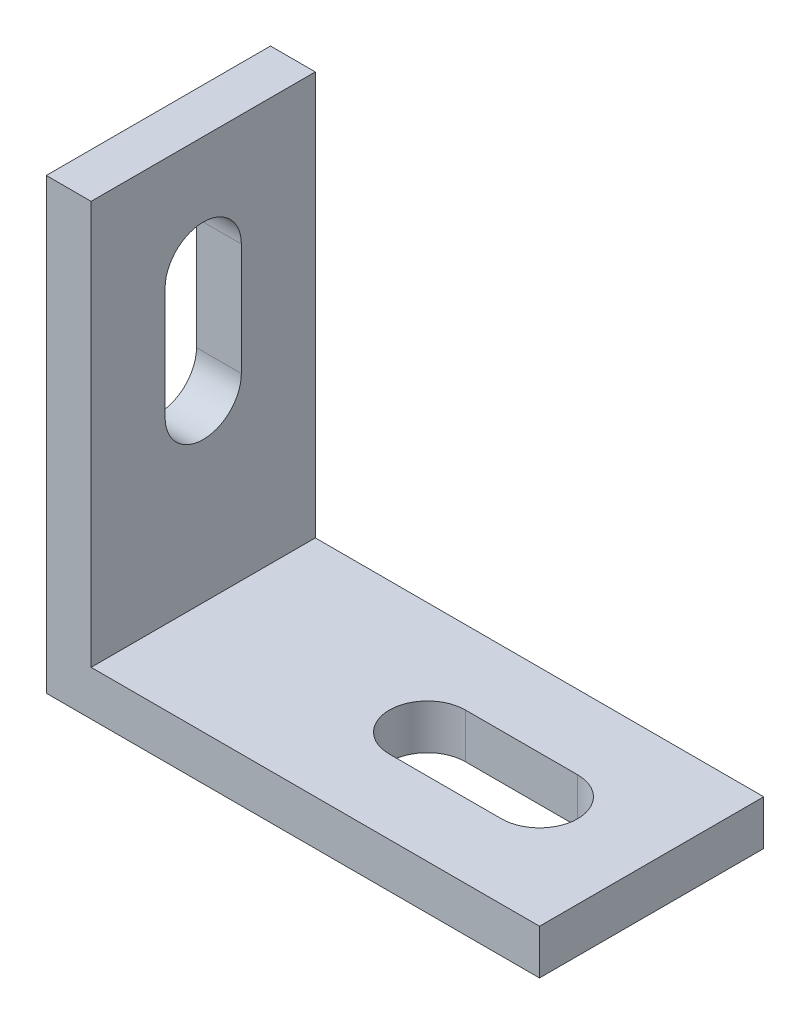
ISO-10303-21;
HEADER;
FILE_DESCRIPTION(('STEP AP214'),'2;1');
FILE_NAME('part.step','',(''),(''),'','','');
FILE_SCHEMA(('AUTOMOTIVE_DESIGN { 1 0 10303 214 1 1 1 1 }'));
ENDSEC;
DATA;
#1=APPLICATION_CONTEXT('core data for automotive mechanical design processes');
#2=APPLICATION_PROTOCOL_DEFINITION('international standard','automotive_design',2000,#1);
#3=PRODUCT_CONTEXT('',#1,'mechanical');
#4=PRODUCT('Part','Part','',(#3));
#5=PRODUCT_RELATED_PRODUCT_CATEGORY('part','',(#4));
#6=PRODUCT_DEFINITION_FORMATION('','',#4);
#7=PRODUCT_DEFINITION_CONTEXT('part definition',#1,'design');
#8=PRODUCT_DEFINITION('design','',#6,#7);
#9=PRODUCT_DEFINITION_SHAPE('','',#8);
#10=(LENGTH_UNIT() NAMED_UNIT(*) SI_UNIT(.MILLI.,.METRE.));
#11=(NAMED_UNIT(*) PLANE_ANGLE_UNIT() SI_UNIT($,.RADIAN.));
#12=(NAMED_UNIT(*) SI_UNIT($,.STERADIAN.) SOLID_ANGLE_UNIT());
#13=UNCERTAINTY_MEASURE_WITH_UNIT(LENGTH_MEASURE(1.E-05),#10,'distance_accuracy_value','');
#14=(GEOMETRIC_REPRESENTATION_CONTEXT(3) GLOBAL_UNCERTAINTY_ASSIGNED_CONTEXT((#13)) GLOBAL_UNIT_ASSIGNED_CONTEXT((#10,
#11,#12)) REPRESENTATION_CONTEXT('',''));
#15=CARTESIAN_POINT('',(0.,0.,0.));
#16=DIRECTION('',(0.,0.,1.));
#17=DIRECTION('',(1.,0.,0.));
#18=AXIS2_PLACEMENT_3D('',#15,#16,#17);
#19=CARTESIAN_POINT('',(0.,2.,0.));
#20=DIRECTION('',(0.,-1.,0.));
#21=DIRECTION('',(0.,0.,-1.));
#22=AXIS2_PLACEMENT_3D('',#19,#20,#21);
#23=PLANE('',#22);
#24=DIRECTION('',(0.,0.,-1.));
#25=VECTOR('',#24,1.);
#26=CARTESIAN_POINT('',(10.,2.,5.));
#27=LINE('',#26,#25);
#28=CARTESIAN_POINT('',(10.,2.,5.));
#29=VERTEX_POINT('',#28);
#30=CARTESIAN_POINT('',(10.,2.,-5.));
#31=VERTEX_POINT('',#30);
#32=EDGE_CURVE('E227',#29,#31,#27,.T.);
#33=ORIENTED_EDGE('',*,*,#32,.T.);
#34=DIRECTION('',(-1.,0.,0.));
#35=VECTOR('',#34,1.);
#36=CARTESIAN_POINT('',(-10.,2.,-5.));
#37=LINE('',#36,#35);
#38=CARTESIAN_POINT('',(-10.,2.,-5.));
#39=VERTEX_POINT('',#38);
#40=EDGE_CURVE('E230',#31,#39,#37,.T.);
#41=ORIENTED_EDGE('',*,*,#40,.T.);
#42=DIRECTION('',(0.,0.,1.));
#43=VECTOR('',#42,1.);
#44=CARTESIAN_POINT('',(-10.,2.,5.));
#45=LINE('',#44,#43);
#46=CARTESIAN_POINT('',(-10.,2.,5.));
#47=VERTEX_POINT('',#46);
#48=EDGE_CURVE('E234',#39,#47,#45,.T.);
#49=ORIENTED_EDGE('',*,*,#48,.T.);
#50=DIRECTION('',(1.,0.,0.));
#51=VECTOR('',#50,1.);
#52=CARTESIAN_POINT('',(-10.,2.,5.));
#53=LINE('',#52,#51);
#54=EDGE_CURVE('E237',#47,#29,#53,.T.);
#55=ORIENTED_EDGE('',*,*,#54,.T.);
#56=EDGE_LOOP('',(#33,#41,#49,#55));
#57=FACE_BOUND('',#56,.T.);
#58=CARTESIAN_POINT('',(5.,2.,0.));
#59=DIRECTION('',(0.,1.,0.));
#60=DIRECTION('',(0.,0.,1.));
#61=AXIS2_PLACEMENT_3D('',#58,#59,#60);
#62=CIRCLE('',#61,1.7);
#63=CARTESIAN_POINT('',(5.,2.,1.7));
#64=VERTEX_POINT('',#63);
#65=CARTESIAN_POINT('',(5.,2.,-1.7));
#66=VERTEX_POINT('',#65);
#67=EDGE_CURVE('E201',#64,#66,#62,.T.);
#68=ORIENTED_EDGE('',*,*,#67,.F.);
#69=DIRECTION('',(1.,0.,0.));
#70=VECTOR('',#69,1.);
#71=CARTESIAN_POINT('',(5.,2.,1.7));
#72=LINE('',#71,#70);
#73=CARTESIAN_POINT('',(0.,2.,1.7));
#74=VERTEX_POINT('',#73);
#75=EDGE_CURVE('E208',#74,#64,#72,.T.);
#76=ORIENTED_EDGE('',*,*,#75,.F.);
#77=CARTESIAN_POINT('',(0.,2.,0.));
#78=DIRECTION('',(0.,1.,0.));
#79=DIRECTION('',(0.,0.,1.));
#80=AXIS2_PLACEMENT_3D('',#77,#78,#79);
#81=CIRCLE('',#80,1.7);
#82=CARTESIAN_POINT('',(0.,2.,-1.7));
#83=VERTEX_POINT('',#82);
#84=EDGE_CURVE('E206',#83,#74,#81,.T.);
#85=ORIENTED_EDGE('',*,*,#84,.F.);
#86=DIRECTION('',(-1.,0.,0.));
#87=VECTOR('',#86,1.);
#88=CARTESIAN_POINT('',(5.,2.,-1.7));
#89=LINE('',#88,#87);
#90=EDGE_CURVE('E203',#66,#83,#89,.T.);
#91=ORIENTED_EDGE('',*,*,#90,.F.);
#92=EDGE_LOOP('',(#68,#76,#85,#91));
#93=FACE_BOUND('',#92,.T.);
#94=ADVANCED_FACE('F33',(#57,#93),#23,.F.);
#95=CARTESIAN_POINT('',(0.,0.,0.));
#96=DIRECTION('',(0.,-1.,0.));
#97=DIRECTION('',(0.,0.,-1.));
#98=AXIS2_PLACEMENT_3D('',#95,#96,#97);
#99=PLANE('',#98);
#100=DIRECTION('',(0.,0.,-1.));
#101=VECTOR('',#100,1.);
#102=CARTESIAN_POINT('',(10.,0.,5.));
#103=LINE('',#102,#101);
#104=CARTESIAN_POINT('',(10.,0.,5.));
#105=VERTEX_POINT('',#104);
#106=CARTESIAN_POINT('',(10.,0.,-5.));
#107=VERTEX_POINT('',#106);
#108=EDGE_CURVE('E226',#105,#107,#103,.T.);
#109=ORIENTED_EDGE('',*,*,#108,.F.);
#110=DIRECTION('',(1.,0.,0.));
#111=VECTOR('',#110,1.);
#112=CARTESIAN_POINT('',(-10.,0.,5.));
#113=LINE('',#112,#111);
#114=CARTESIAN_POINT('',(-12.,0.,5.));
#115=VERTEX_POINT('',#114);
#116=EDGE_CURVE('E231',#115,#105,#113,.T.);
#117=ORIENTED_EDGE('',*,*,#116,.F.);
#118=DIRECTION('',(0.,0.,1.));
#119=VECTOR('',#118,1.);
#120=CARTESIAN_POINT('',(-12.,0.,-5.));
#121=LINE('',#120,#119);
#122=CARTESIAN_POINT('',(-12.,0.,-5.));
#123=VERTEX_POINT('',#122);
#124=EDGE_CURVE('E182',#123,#115,#121,.T.);
#125=ORIENTED_EDGE('',*,*,#124,.F.);
#126=DIRECTION('',(-1.,0.,0.));
#127=VECTOR('',#126,1.);
#128=CARTESIAN_POINT('',(-10.,0.,-5.));
#129=LINE('',#128,#127);
#130=EDGE_CURVE('E241',#107,#123,#129,.T.);
#131=ORIENTED_EDGE('',*,*,#130,.F.);
#132=EDGE_LOOP('',(#109,#117,#125,#131));
#133=FACE_BOUND('',#132,.T.);
#134=DIRECTION('',(1.,0.,0.));
#135=VECTOR('',#134,1.);
#136=CARTESIAN_POINT('',(5.,0.,1.7));
#137=LINE('',#136,#135);
#138=CARTESIAN_POINT('',(0.,0.,1.7));
#139=VERTEX_POINT('',#138);
#140=CARTESIAN_POINT('',(5.,0.,1.7));
#141=VERTEX_POINT('',#140);
#142=EDGE_CURVE('E204',#139,#141,#137,.T.);
#143=ORIENTED_EDGE('',*,*,#142,.T.);
#144=CARTESIAN_POINT('',(5.,0.,0.));
#145=DIRECTION('',(0.,1.,0.));
#146=DIRECTION('',(0.,0.,1.));
#147=AXIS2_PLACEMENT_3D('',#144,#145,#146);
#148=CIRCLE('',#147,1.7);
#149=CARTESIAN_POINT('',(5.,0.,-1.7));
#150=VERTEX_POINT('',#149);
#151=EDGE_CURVE('E56',#141,#150,#148,.T.);
#152=ORIENTED_EDGE('',*,*,#151,.T.);
#153=DIRECTION('',(-1.,0.,0.));
#154=VECTOR('',#153,1.);
#155=CARTESIAN_POINT('',(5.,0.,-1.7));
#156=LINE('',#155,#154);
#157=CARTESIAN_POINT('',(0.,0.,-1.7));
#158=VERTEX_POINT('',#157);
#159=EDGE_CURVE('E212',#150,#158,#156,.T.);
#160=ORIENTED_EDGE('',*,*,#159,.T.);
#161=CARTESIAN_POINT('',(0.,0.,0.));
#162=DIRECTION('',(0.,1.,0.));
#163=DIRECTION('',(0.,0.,1.));
#164=AXIS2_PLACEMENT_3D('',#161,#162,#163);
#165=CIRCLE('',#164,1.7);
#166=EDGE_CURVE('E215',#158,#139,#165,.T.);
#167=ORIENTED_EDGE('',*,*,#166,.T.);
#168=EDGE_LOOP('',(#143,#152,#160,#167));
#169=FACE_BOUND('',#168,.T.);
#170=ADVANCED_FACE('F252',(#133,#169),#99,.T.);
#171=CARTESIAN_POINT('',(10.,2.,5.));
#172=DIRECTION('',(-1.,0.,0.));
#173=DIRECTION('',(0.,0.,1.));
#174=AXIS2_PLACEMENT_3D('',#171,#172,#173);
#175=PLANE('',#174);
#176=ORIENTED_EDGE('',*,*,#108,.T.);
#177=DIRECTION('',(0.,-1.,0.));
#178=VECTOR('',#177,1.);
#179=CARTESIAN_POINT('',(10.,2.,-5.));
#180=LINE('',#179,#178);
#181=EDGE_CURVE('E11',#31,#107,#180,.T.);
#182=ORIENTED_EDGE('',*,*,#181,.F.);
#183=ORIENTED_EDGE('',*,*,#32,.F.);
#184=DIRECTION('',(0.,-1.,0.));
#185=VECTOR('',#184,1.);
#186=CARTESIAN_POINT('',(10.,2.,5.));
#187=LINE('',#186,#185);
#188=EDGE_CURVE('E41',#29,#105,#187,.T.);
#189=ORIENTED_EDGE('',*,*,#188,.T.);
#190=EDGE_LOOP('',(#176,#182,#183,#189));
#191=FACE_BOUND('',#190,.T.);
#192=ADVANCED_FACE('F35',(#191),#175,.F.);
#193=CARTESIAN_POINT('',(-10.,2.,-5.));
#194=DIRECTION('',(0.,0.,1.));
#195=DIRECTION('',(1.,0.,0.));
#196=AXIS2_PLACEMENT_3D('',#193,#194,#195);
#197=PLANE('',#196);
#198=ORIENTED_EDGE('',*,*,#130,.T.);
#199=DIRECTION('',(0.,-1.,0.));
#200=VECTOR('',#199,1.);
#201=CARTESIAN_POINT('',(-12.,0.,-5.));
#202=LINE('',#201,#200);
#203=CARTESIAN_POINT('',(-12.,20.,-5.));
#204=VERTEX_POINT('',#203);
#205=EDGE_CURVE('E179',#204,#123,#202,.T.);
#206=ORIENTED_EDGE('',*,*,#205,.F.);
#207=DIRECTION('',(1.,0.,0.));
#208=VECTOR('',#207,1.);
#209=CARTESIAN_POINT('',(-12.,20.,-5.));
#210=LINE('',#209,#208);
#211=CARTESIAN_POINT('',(-10.,20.,-5.));
#212=VERTEX_POINT('',#211);
#213=EDGE_CURVE('E190',#204,#212,#210,.T.);
#214=ORIENTED_EDGE('',*,*,#213,.T.);
#215=DIRECTION('',(0.,-1.,0.));
#216=VECTOR('',#215,1.);
#217=CARTESIAN_POINT('',(-10.,0.,-5.));
#218=LINE('',#217,#216);
#219=EDGE_CURVE('E155',#212,#39,#218,.T.);
#220=ORIENTED_EDGE('',*,*,#219,.T.);
#221=ORIENTED_EDGE('',*,*,#40,.F.);
#222=ORIENTED_EDGE('',*,*,#181,.T.);
#223=EDGE_LOOP('',(#198,#206,#214,#220,#221,#222));
#224=FACE_BOUND('',#223,.T.);
#225=ADVANCED_FACE('F257',(#224),#197,.F.);
#226=CARTESIAN_POINT('',(-10.,2.,5.));
#227=DIRECTION('',(0.,0.,-1.));
#228=DIRECTION('',(-1.,0.,0.));
#229=AXIS2_PLACEMENT_3D('',#226,#227,#228);
#230=PLANE('',#229);
#231=ORIENTED_EDGE('',*,*,#116,.T.);
#232=ORIENTED_EDGE('',*,*,#188,.F.);
#233=ORIENTED_EDGE('',*,*,#54,.F.);
#234=DIRECTION('',(0.,1.,0.));
#235=VECTOR('',#234,1.);
#236=CARTESIAN_POINT('',(-10.,0.,5.));
#237=LINE('',#236,#235);
#238=CARTESIAN_POINT('',(-10.,20.,5.));
#239=VERTEX_POINT('',#238);
#240=EDGE_CURVE('E193',#47,#239,#237,.T.);
#241=ORIENTED_EDGE('',*,*,#240,.T.);
#242=DIRECTION('',(1.,0.,0.));
#243=VECTOR('',#242,1.);
#244=CARTESIAN_POINT('',(-12.,20.,5.));
#245=LINE('',#244,#243);
#246=CARTESIAN_POINT('',(-12.,20.,5.));
#247=VERTEX_POINT('',#246);
#248=EDGE_CURVE('E198',#247,#239,#245,.T.);
#249=ORIENTED_EDGE('',*,*,#248,.F.);
#250=DIRECTION('',(0.,1.,0.));
#251=VECTOR('',#250,1.);
#252=CARTESIAN_POINT('',(-12.,0.,5.));
#253=LINE('',#252,#251);
#254=EDGE_CURVE('E186',#115,#247,#253,.T.);
#255=ORIENTED_EDGE('',*,*,#254,.F.);
#256=EDGE_LOOP('',(#231,#232,#233,#241,#249,#255));
#257=FACE_BOUND('',#256,.T.);
#258=ADVANCED_FACE('F261',(#257),#230,.F.);
#259=CARTESIAN_POINT('',(5.,2.,0.));
#260=DIRECTION('',(0.,-1.,0.));
#261=DIRECTION('',(0.,0.,-1.));
#262=AXIS2_PLACEMENT_3D('',#259,#260,#261);
#263=CYLINDRICAL_SURFACE('',#262,1.7);
#264=ORIENTED_EDGE('',*,*,#151,.F.);
#265=DIRECTION('',(0.,-1.,0.));
#266=VECTOR('',#265,1.);
#267=CARTESIAN_POINT('',(5.,2.,1.7));
#268=LINE('',#267,#266);
#269=EDGE_CURVE('E210',#64,#141,#268,.T.);
#270=ORIENTED_EDGE('',*,*,#269,.F.);
#271=ORIENTED_EDGE('',*,*,#67,.T.);
#272=DIRECTION('',(0.,-1.,0.));
#273=VECTOR('',#272,1.);
#274=CARTESIAN_POINT('',(5.,2.,-1.7));
#275=LINE('',#274,#273);
#276=EDGE_CURVE('E224',#66,#150,#275,.T.);
#277=ORIENTED_EDGE('',*,*,#276,.T.);
#278=EDGE_LOOP('',(#264,#270,#271,#277));
#279=FACE_BOUND('',#278,.T.);
#280=ADVANCED_FACE('F291',(#279),#263,.F.);
#281=CARTESIAN_POINT('',(5.,2.,-1.7));
#282=DIRECTION('',(0.,0.,1.));
#283=DIRECTION('',(1.,0.,0.));
#284=AXIS2_PLACEMENT_3D('',#281,#282,#283);
#285=PLANE('',#284);
#286=ORIENTED_EDGE('',*,*,#159,.F.);
#287=ORIENTED_EDGE('',*,*,#276,.F.);
#288=ORIENTED_EDGE('',*,*,#90,.T.);
#289=DIRECTION('',(0.,-1.,0.));
#290=VECTOR('',#289,1.);
#291=CARTESIAN_POINT('',(0.,2.,-1.7));
#292=LINE('',#291,#290);
#293=EDGE_CURVE('E222',#83,#158,#292,.T.);
#294=ORIENTED_EDGE('',*,*,#293,.T.);
#295=EDGE_LOOP('',(#286,#287,#288,#294));
#296=FACE_BOUND('',#295,.T.);
#297=ADVANCED_FACE('F385',(#296),#285,.T.);
#298=CARTESIAN_POINT('',(0.,2.,0.));
#299=DIRECTION('',(0.,-1.,0.));
#300=DIRECTION('',(0.,0.,-1.));
#301=AXIS2_PLACEMENT_3D('',#298,#299,#300);
#302=CYLINDRICAL_SURFACE('',#301,1.7);
#303=ORIENTED_EDGE('',*,*,#166,.F.);
#304=ORIENTED_EDGE('',*,*,#293,.F.);
#305=ORIENTED_EDGE('',*,*,#84,.T.);
#306=DIRECTION('',(0.,-1.,0.));
#307=VECTOR('',#306,1.);
#308=CARTESIAN_POINT('',(0.,2.,1.7));
#309=LINE('',#308,#307);
#310=EDGE_CURVE('E48',#74,#139,#309,.T.);
#311=ORIENTED_EDGE('',*,*,#310,.T.);
#312=EDGE_LOOP('',(#303,#304,#305,#311));
#313=FACE_BOUND('',#312,.T.);
#314=ADVANCED_FACE('F281',(#313),#302,.F.);
#315=CARTESIAN_POINT('',(5.,2.,1.7));
#316=DIRECTION('',(0.,0.,-1.));
#317=DIRECTION('',(-1.,0.,0.));
#318=AXIS2_PLACEMENT_3D('',#315,#316,#317);
#319=PLANE('',#318);
#320=ORIENTED_EDGE('',*,*,#142,.F.);
#321=ORIENTED_EDGE('',*,*,#310,.F.);
#322=ORIENTED_EDGE('',*,*,#75,.T.);
#323=ORIENTED_EDGE('',*,*,#269,.T.);
#324=EDGE_LOOP('',(#320,#321,#322,#323));
#325=FACE_BOUND('',#324,.T.);
#326=ADVANCED_FACE('F272',(#325),#319,.T.);
#327=CARTESIAN_POINT('',(-10.,0.,0.));
#328=DIRECTION('',(1.,0.,0.));
#329=DIRECTION('',(0.,0.,-1.));
#330=AXIS2_PLACEMENT_3D('',#327,#328,#329);
#331=PLANE('',#330);
#332=DIRECTION('',(0.,1.,0.));
#333=VECTOR('',#332,1.);
#334=CARTESIAN_POINT('',(-10.,15.,1.7));
#335=LINE('',#334,#333);
#336=CARTESIAN_POINT('',(-10.,10.,1.7));
#337=VERTEX_POINT('',#336);
#338=CARTESIAN_POINT('',(-10.,15.,1.7));
#339=VERTEX_POINT('',#338);
#340=EDGE_CURVE('E148',#337,#339,#335,.T.);
#341=ORIENTED_EDGE('',*,*,#340,.T.);
#342=CARTESIAN_POINT('',(-10.,15.,0.));
#343=DIRECTION('',(-1.,0.,0.));
#344=DIRECTION('',(0.,0.,1.));
#345=AXIS2_PLACEMENT_3D('',#342,#343,#344);
#346=CIRCLE('',#345,1.7);
#347=CARTESIAN_POINT('',(-10.,15.,-1.7));
#348=VERTEX_POINT('',#347);
#349=EDGE_CURVE('E167',#339,#348,#346,.T.);
#350=ORIENTED_EDGE('',*,*,#349,.T.);
#351=DIRECTION('',(0.,-1.,0.));
#352=VECTOR('',#351,1.);
#353=CARTESIAN_POINT('',(-10.,15.,-1.7));
#354=LINE('',#353,#352);
#355=CARTESIAN_POINT('',(-10.,10.,-1.7));
#356=VERTEX_POINT('',#355);
#357=EDGE_CURVE('E154',#348,#356,#354,.T.);
#358=ORIENTED_EDGE('',*,*,#357,.T.);
#359=CARTESIAN_POINT('',(-10.,10.,0.));
#360=DIRECTION('',(-1.,0.,0.));
#361=DIRECTION('',(0.,0.,1.));
#362=AXIS2_PLACEMENT_3D('',#359,#360,#361);
#363=CIRCLE('',#362,1.7);
#364=EDGE_CURVE('E170',#356,#337,#363,.T.);
#365=ORIENTED_EDGE('',*,*,#364,.T.);
#366=EDGE_LOOP('',(#341,#350,#358,#365));
#367=FACE_BOUND('',#366,.T.);
#368=ORIENTED_EDGE('',*,*,#48,.F.);
#369=ORIENTED_EDGE('',*,*,#219,.F.);
#370=DIRECTION('',(0.,0.,-1.));
#371=VECTOR('',#370,1.);
#372=CARTESIAN_POINT('',(-10.,20.,-5.));
#373=LINE('',#372,#371);
#374=EDGE_CURVE('E183',#239,#212,#373,.T.);
#375=ORIENTED_EDGE('',*,*,#374,.F.);
#376=ORIENTED_EDGE('',*,*,#240,.F.);
#377=EDGE_LOOP('',(#368,#369,#375,#376));
#378=FACE_BOUND('',#377,.T.);
#379=ADVANCED_FACE('F270',(#367,#378),#331,.T.);
#380=CARTESIAN_POINT('',(-12.,0.,0.));
#381=DIRECTION('',(1.,0.,0.));
#382=DIRECTION('',(0.,0.,-1.));
#383=AXIS2_PLACEMENT_3D('',#380,#381,#382);
#384=PLANE('',#383);
#385=ORIENTED_EDGE('',*,*,#205,.T.);
#386=ORIENTED_EDGE('',*,*,#124,.T.);
#387=ORIENTED_EDGE('',*,*,#254,.T.);
#388=DIRECTION('',(0.,0.,-1.));
#389=VECTOR('',#388,1.);
#390=CARTESIAN_POINT('',(-12.,20.,-5.));
#391=LINE('',#390,#389);
#392=EDGE_CURVE('E188',#247,#204,#391,.T.);
#393=ORIENTED_EDGE('',*,*,#392,.T.);
#394=EDGE_LOOP('',(#385,#386,#387,#393));
#395=FACE_BOUND('',#394,.T.);
#396=CARTESIAN_POINT('',(-12.,15.,0.));
#397=DIRECTION('',(-1.,0.,0.));
#398=DIRECTION('',(0.,0.,1.));
#399=AXIS2_PLACEMENT_3D('',#396,#397,#398);
#400=CIRCLE('',#399,1.7);
#401=CARTESIAN_POINT('',(-12.,15.,1.7));
#402=VERTEX_POINT('',#401);
#403=CARTESIAN_POINT('',(-12.,15.,-1.7));
#404=VERTEX_POINT('',#403);
#405=EDGE_CURVE('E137',#402,#404,#400,.T.);
#406=ORIENTED_EDGE('',*,*,#405,.F.);
#407=DIRECTION('',(0.,1.,0.));
#408=VECTOR('',#407,1.);
#409=CARTESIAN_POINT('',(-12.,15.,1.7));
#410=LINE('',#409,#408);
#411=CARTESIAN_POINT('',(-12.,10.,1.7));
#412=VERTEX_POINT('',#411);
#413=EDGE_CURVE('E163',#412,#402,#410,.T.);
#414=ORIENTED_EDGE('',*,*,#413,.F.);
#415=CARTESIAN_POINT('',(-12.,10.,0.));
#416=DIRECTION('',(-1.,0.,0.));
#417=DIRECTION('',(0.,0.,1.));
#418=AXIS2_PLACEMENT_3D('',#415,#416,#417);
#419=CIRCLE('',#418,1.7);
#420=CARTESIAN_POINT('',(-12.,10.,-1.7));
#421=VERTEX_POINT('',#420);
#422=EDGE_CURVE('E161',#421,#412,#419,.T.);
#423=ORIENTED_EDGE('',*,*,#422,.F.);
#424=DIRECTION('',(0.,-1.,0.));
#425=VECTOR('',#424,1.);
#426=CARTESIAN_POINT('',(-12.,15.,-1.7));
#427=LINE('',#426,#425);
#428=EDGE_CURVE('E147',#404,#421,#427,.T.);
#429=ORIENTED_EDGE('',*,*,#428,.F.);
#430=EDGE_LOOP('',(#406,#414,#423,#429));
#431=FACE_BOUND('',#430,.T.);
#432=ADVANCED_FACE('F159',(#395,#431),#384,.F.);
#433=CARTESIAN_POINT('',(-12.,20.,-5.));
#434=DIRECTION('',(0.,-1.,0.));
#435=DIRECTION('',(0.,0.,-1.));
#436=AXIS2_PLACEMENT_3D('',#433,#434,#435);
#437=PLANE('',#436);
#438=ORIENTED_EDGE('',*,*,#374,.T.);
#439=ORIENTED_EDGE('',*,*,#213,.F.);
#440=ORIENTED_EDGE('',*,*,#392,.F.);
#441=ORIENTED_EDGE('',*,*,#248,.T.);
#442=EDGE_LOOP('',(#438,#439,#440,#441));
#443=FACE_BOUND('',#442,.T.);
#444=ADVANCED_FACE('F268',(#443),#437,.F.);
#445=CARTESIAN_POINT('',(-12.,15.,0.));
#446=DIRECTION('',(1.,0.,0.));
#447=DIRECTION('',(0.,0.,-1.));
#448=AXIS2_PLACEMENT_3D('',#445,#446,#447);
#449=CYLINDRICAL_SURFACE('',#448,1.7);
#450=ORIENTED_EDGE('',*,*,#349,.F.);
#451=DIRECTION('',(1.,0.,0.));
#452=VECTOR('',#451,1.);
#453=CARTESIAN_POINT('',(-12.,15.,1.7));
#454=LINE('',#453,#452);
#455=EDGE_CURVE('E143',#402,#339,#454,.T.);
#456=ORIENTED_EDGE('',*,*,#455,.F.);
#457=ORIENTED_EDGE('',*,*,#405,.T.);
#458=DIRECTION('',(1.,0.,0.));
#459=VECTOR('',#458,1.);
#460=CARTESIAN_POINT('',(-12.,15.,-1.7));
#461=LINE('',#460,#459);
#462=EDGE_CURVE('E140',#404,#348,#461,.T.);
#463=ORIENTED_EDGE('',*,*,#462,.T.);
#464=EDGE_LOOP('',(#450,#456,#457,#463));
#465=FACE_BOUND('',#464,.T.);
#466=ADVANCED_FACE('F139',(#465),#449,.F.);
#467=CARTESIAN_POINT('',(-12.,15.,-1.7));
#468=DIRECTION('',(0.,0.,1.));
#469=DIRECTION('',(0.,-1.,0.));
#470=AXIS2_PLACEMENT_3D('',#467,#468,#469);
#471=PLANE('',#470);
#472=ORIENTED_EDGE('',*,*,#357,.F.);
#473=ORIENTED_EDGE('',*,*,#462,.F.);
#474=ORIENTED_EDGE('',*,*,#428,.T.);
#475=DIRECTION('',(1.,0.,0.));
#476=VECTOR('',#475,1.);
#477=CARTESIAN_POINT('',(-12.,10.,-1.7));
#478=LINE('',#477,#476);
#479=EDGE_CURVE('E156',#421,#356,#478,.T.);
#480=ORIENTED_EDGE('',*,*,#479,.T.);
#481=EDGE_LOOP('',(#472,#473,#474,#480));
#482=FACE_BOUND('',#481,.T.);
#483=ADVANCED_FACE('F151',(#482),#471,.T.);
#484=CARTESIAN_POINT('',(-12.,10.,0.));
#485=DIRECTION('',(1.,0.,0.));
#486=DIRECTION('',(0.,0.,-1.));
#487=AXIS2_PLACEMENT_3D('',#484,#485,#486);
#488=CYLINDRICAL_SURFACE('',#487,1.7);
#489=ORIENTED_EDGE('',*,*,#364,.F.);
#490=ORIENTED_EDGE('',*,*,#479,.F.);
#491=ORIENTED_EDGE('',*,*,#422,.T.);
#492=DIRECTION('',(1.,0.,0.));
#493=VECTOR('',#492,1.);
#494=CARTESIAN_POINT('',(-12.,10.,1.7));
#495=LINE('',#494,#493);
#496=EDGE_CURVE('E176',#412,#337,#495,.T.);
#497=ORIENTED_EDGE('',*,*,#496,.T.);
#498=EDGE_LOOP('',(#489,#490,#491,#497));
#499=FACE_BOUND('',#498,.T.);
#500=ADVANCED_FACE('F358',(#499),#488,.F.);
#501=CARTESIAN_POINT('',(-12.,15.,1.7));
#502=DIRECTION('',(0.,0.,-1.));
#503=DIRECTION('',(0.,1.,0.));
#504=AXIS2_PLACEMENT_3D('',#501,#502,#503);
#505=PLANE('',#504);
#506=ORIENTED_EDGE('',*,*,#340,.F.);
#507=ORIENTED_EDGE('',*,*,#496,.F.);
#508=ORIENTED_EDGE('',*,*,#413,.T.);
#509=ORIENTED_EDGE('',*,*,#455,.T.);
#510=EDGE_LOOP('',(#506,#507,#508,#509));
#511=FACE_BOUND('',#510,.T.);
#512=ADVANCED_FACE('F367',(#511),#505,.T.);
#513=CLOSED_SHELL('',(#94,#170,#192,#225,#258,#280,#297,#314,#326,#379,#432,#444,#466,#483,#500,#512));
#514=MANIFOLD_SOLID_BREP('B2',#513);
#515=ADVANCED_BREP_SHAPE_REPRESENTATION('',(#18,#514),#14);
#516=SHAPE_DEFINITION_REPRESENTATION(#9,#515);
ENDSEC;
END-ISO-10303-21;
